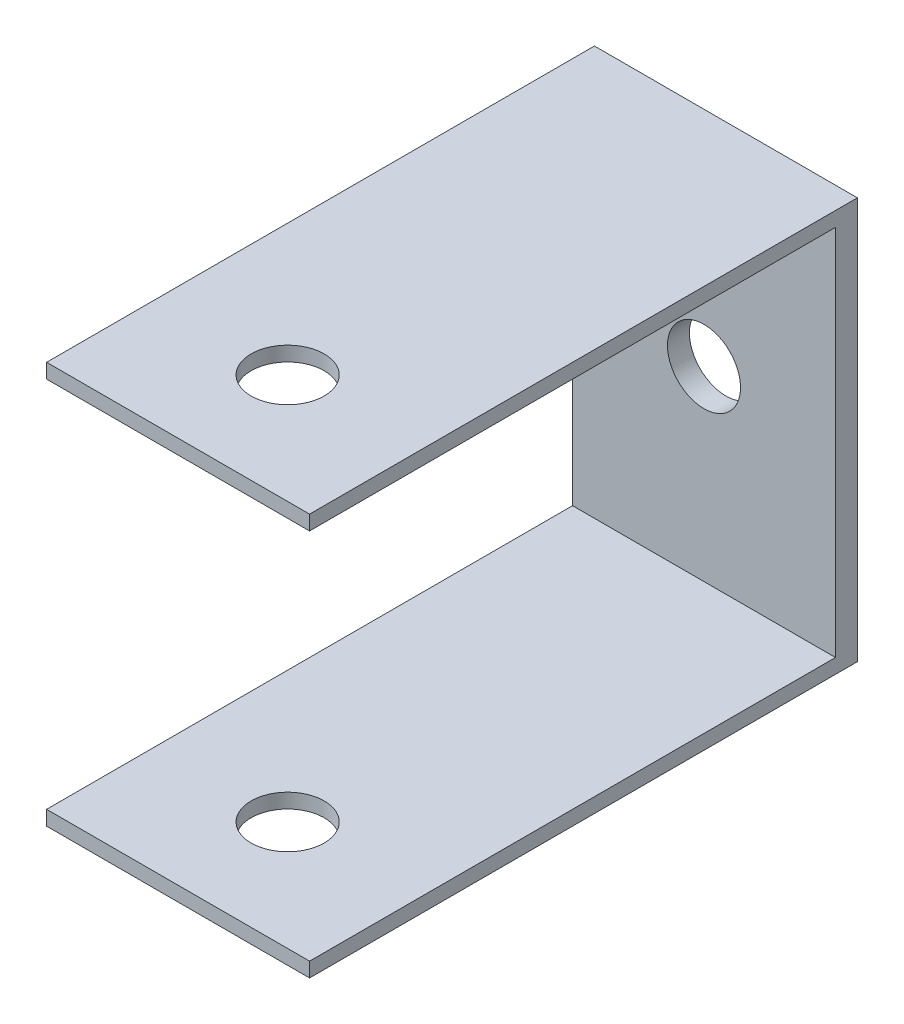
ISO-10303-21;
HEADER;
FILE_DESCRIPTION(('STEP AP214'),'2;1');
FILE_NAME('part.step','',(''),(''),'','','');
FILE_SCHEMA(('AUTOMOTIVE_DESIGN { 1 0 10303 214 1 1 1 1 }'));
ENDSEC;
DATA;
#1=APPLICATION_CONTEXT('core data for automotive mechanical design processes');
#2=APPLICATION_PROTOCOL_DEFINITION('international standard','automotive_design',2000,#1);
#3=PRODUCT_CONTEXT('',#1,'mechanical');
#4=PRODUCT('Part','Part','',(#3));
#5=PRODUCT_RELATED_PRODUCT_CATEGORY('part','',(#4));
#6=PRODUCT_DEFINITION_FORMATION('','',#4);
#7=PRODUCT_DEFINITION_CONTEXT('part definition',#1,'design');
#8=PRODUCT_DEFINITION('design','',#6,#7);
#9=PRODUCT_DEFINITION_SHAPE('','',#8);
#10=(LENGTH_UNIT() NAMED_UNIT(*) SI_UNIT(.MILLI.,.METRE.));
#11=(NAMED_UNIT(*) PLANE_ANGLE_UNIT() SI_UNIT($,.RADIAN.));
#12=(NAMED_UNIT(*) SI_UNIT($,.STERADIAN.) SOLID_ANGLE_UNIT());
#13=UNCERTAINTY_MEASURE_WITH_UNIT(LENGTH_MEASURE(1.E-05),#10,'distance_accuracy_value','');
#14=(GEOMETRIC_REPRESENTATION_CONTEXT(3) GLOBAL_UNCERTAINTY_ASSIGNED_CONTEXT((#13)) GLOBAL_UNIT_ASSIGNED_CONTEXT((#10,
#11,#12)) REPRESENTATION_CONTEXT('',''));
#15=CARTESIAN_POINT('',(0.,0.,0.));
#16=DIRECTION('',(0.,0.,1.));
#17=DIRECTION('',(1.,0.,0.));
#18=AXIS2_PLACEMENT_3D('',#15,#16,#17);
#19=CARTESIAN_POINT('',(0.,0.,57.));
#20=DIRECTION('',(0.,0.,-1.));
#21=DIRECTION('',(-1.,0.,0.));
#22=AXIS2_PLACEMENT_3D('',#19,#20,#21);
#23=CYLINDRICAL_SURFACE('',#22,5.);
#24=CARTESIAN_POINT('',(0.,0.,0.));
#25=DIRECTION('',(0.,0.,-1.));
#26=DIRECTION('',(-1.,0.,0.));
#27=AXIS2_PLACEMENT_3D('',#24,#25,#26);
#28=CIRCLE('',#27,5.);
#29=CARTESIAN_POINT('',(-5.,0.,0.));
#30=VERTEX_POINT('',#29);
#31=EDGE_CURVE('E157',#30,#30,#28,.T.);
#32=CARTESIAN_POINT('',(0.,0.,3.00000000000003));
#33=DIRECTION('',(0.,0.,1.));
#34=DIRECTION('',(1.,0.,0.));
#35=AXIS2_PLACEMENT_3D('',#32,#33,#34);
#36=CIRCLE('',#35,5.);
#37=CARTESIAN_POINT('',(-5.,0.,3.00000000000003));
#38=VERTEX_POINT('',#37);
#39=EDGE_CURVE('E156',#38,#38,#36,.F.);
#40=CARTESIAN_POINT('',(-5.,0.,0.));
#41=CARTESIAN_POINT('',(-5.,0.,0.0312500000000012));
#42=CARTESIAN_POINT('',(-5.,0.,0.0625000000000024));
#43=CARTESIAN_POINT('',(-5.,0.,0.125000000000002));
#44=CARTESIAN_POINT('',(-5.,0.,0.156250000000001));
#45=CARTESIAN_POINT('',(-5.,0.,0.218750000000001));
#46=CARTESIAN_POINT('',(-5.,0.,0.250000000000002));
#47=CARTESIAN_POINT('',(-5.,0.,0.312500000000003));
#48=CARTESIAN_POINT('',(-5.,0.,0.343750000000001));
#49=CARTESIAN_POINT('',(-5.,0.,0.406250000000001));
#50=CARTESIAN_POINT('',(-5.,0.,0.437500000000003));
#51=CARTESIAN_POINT('',(-5.,0.,0.500000000000005));
#52=CARTESIAN_POINT('',(-5.,0.,0.531250000000006));
#53=CARTESIAN_POINT('',(-5.,0.,0.593750000000006));
#54=CARTESIAN_POINT('',(-5.,0.,0.625000000000005));
#55=CARTESIAN_POINT('',(-5.,0.,0.687500000000005));
#56=CARTESIAN_POINT('',(-5.,0.,0.718750000000006));
#57=CARTESIAN_POINT('',(-5.,0.,0.781250000000009));
#58=CARTESIAN_POINT('',(-5.,0.,0.81250000000001));
#59=CARTESIAN_POINT('',(-5.,0.,0.87500000000001));
#60=CARTESIAN_POINT('',(-5.,0.,0.906250000000009));
#61=CARTESIAN_POINT('',(-5.,0.,0.968750000000009));
#62=CARTESIAN_POINT('',(-5.,0.,1.00000000000001));
#63=CARTESIAN_POINT('',(-5.,0.,1.06250000000001));
#64=CARTESIAN_POINT('',(-5.,0.,1.09375000000001));
#65=CARTESIAN_POINT('',(-5.,0.,1.15625000000001));
#66=CARTESIAN_POINT('',(-5.,0.,1.18750000000001));
#67=CARTESIAN_POINT('',(-5.,0.,1.25000000000001));
#68=CARTESIAN_POINT('',(-5.,0.,1.28125000000001));
#69=CARTESIAN_POINT('',(-5.,0.,1.34375000000001));
#70=CARTESIAN_POINT('',(-5.,0.,1.37500000000001));
#71=CARTESIAN_POINT('',(-5.,0.,1.43750000000001));
#72=CARTESIAN_POINT('',(-5.,0.,1.46875000000001));
#73=CARTESIAN_POINT('',(-5.,0.,1.53125000000002));
#74=CARTESIAN_POINT('',(-5.,0.,1.56250000000002));
#75=CARTESIAN_POINT('',(-5.,0.,1.62500000000002));
#76=CARTESIAN_POINT('',(-5.,0.,1.65625000000002));
#77=CARTESIAN_POINT('',(-5.,0.,1.71875000000002));
#78=CARTESIAN_POINT('',(-5.,0.,1.75000000000002));
#79=CARTESIAN_POINT('',(-5.,0.,1.81250000000002));
#80=CARTESIAN_POINT('',(-5.,0.,1.84375000000002));
#81=CARTESIAN_POINT('',(-5.,0.,1.90625000000002));
#82=CARTESIAN_POINT('',(-5.,0.,1.93750000000002));
#83=CARTESIAN_POINT('',(-5.,0.,2.00000000000002));
#84=CARTESIAN_POINT('',(-5.,0.,2.03125000000002));
#85=CARTESIAN_POINT('',(-5.,0.,2.09375000000002));
#86=CARTESIAN_POINT('',(-5.,0.,2.12500000000002));
#87=CARTESIAN_POINT('',(-5.,0.,2.18750000000002));
#88=CARTESIAN_POINT('',(-5.,0.,2.21875000000002));
#89=CARTESIAN_POINT('',(-5.,0.,2.28125000000002));
#90=CARTESIAN_POINT('',(-5.,0.,2.31250000000002));
#91=CARTESIAN_POINT('',(-5.,0.,2.37500000000003));
#92=CARTESIAN_POINT('',(-5.,0.,2.40625000000002));
#93=CARTESIAN_POINT('',(-5.,0.,2.46875000000002));
#94=CARTESIAN_POINT('',(-5.,0.,2.50000000000003));
#95=CARTESIAN_POINT('',(-5.,0.,2.56250000000003));
#96=CARTESIAN_POINT('',(-5.,0.,2.59375000000003));
#97=CARTESIAN_POINT('',(-5.,0.,2.65625000000003));
#98=CARTESIAN_POINT('',(-5.,0.,2.68750000000003));
#99=CARTESIAN_POINT('',(-5.,0.,2.75000000000003));
#100=CARTESIAN_POINT('',(-5.,0.,2.78125000000003));
#101=CARTESIAN_POINT('',(-5.,0.,2.84375000000003));
#102=CARTESIAN_POINT('',(-5.,0.,2.87500000000003));
#103=CARTESIAN_POINT('',(-5.,0.,2.93750000000003));
#104=CARTESIAN_POINT('',(-5.,0.,2.96875000000003));
#105=CARTESIAN_POINT('',(-5.,0.,3.00000000000003));
#106=B_SPLINE_CURVE_WITH_KNOTS('',3,(#40,#41,#42,#43,#44,#45,#46,#47,#48,#49,#50,#51,#52,#53,
#54,#55,#56,#57,#58,#59,#60,#61,#62,#63,#64,#65,#66,#67,#68,#69,#70,#71,#72,#73,#74,#75,#76,#77,
#78,#79,#80,#81,#82,#83,#84,#85,#86,#87,#88,#89,#90,#91,#92,#93,#94,#95,#96,#97,#98,#99,#100,
#101,#102,#103,#104,#105),.UNSPECIFIED.,.F.,.F.,(4,2,2,2,2,2,2,2,2,2,2,2,2,2,2,2,2,2,2,2,2,2,2,
2,2,2,2,2,2,2,2,2,4),(0.,0.0937500000000036,0.1875,0.281250000000004,0.375,0.468750000000004,
0.562500000000007,0.656250000000004,0.750000000000008,0.843750000000011,0.937500000000008,
1.03125000000001,1.12500000000001,1.21875000000001,1.31250000000002,1.40625000000001,
1.50000000000002,1.59375000000002,1.68750000000002,1.78125000000002,1.87500000000002,
1.96875000000002,2.06250000000002,2.15625000000002,2.25000000000002,2.34375000000003,
2.43750000000002,2.53125000000003,2.62500000000003,2.71875000000003,2.81250000000003,
2.90625000000003,3.00000000000003),.UNSPECIFIED.);
#107=EDGE_CURVE('BSEAM39',#30,#38,#106,.T.);
#108=ORIENTED_EDGE('',*,*,#31,.T.);
#109=ORIENTED_EDGE('',*,*,#39,.F.);
#110=ORIENTED_EDGE('',*,*,#107,.T.);
#111=ORIENTED_EDGE('',*,*,#107,.F.);
#112=EDGE_LOOP('',(#108,#110,#109,#111));
#113=FACE_BOUND('',#112,.T.);
#114=ADVANCED_FACE('F39',(#113),#23,.F.);
#115=CARTESIAN_POINT('',(0.,0.,75.));
#116=DIRECTION('',(0.,0.,-1.));
#117=DIRECTION('',(-1.,0.,0.));
#118=AXIS2_PLACEMENT_3D('',#115,#116,#117);
#119=PLANE('',#118);
#120=DIRECTION('',(0.,1.,0.));
#121=VECTOR('',#120,1.);
#122=CARTESIAN_POINT('',(18.,27.5,75.));
#123=LINE('',#122,#121);
#124=CARTESIAN_POINT('',(18.,-27.5,75.));
#125=VERTEX_POINT('',#124);
#126=CARTESIAN_POINT('',(18.,-25.5,75.));
#127=VERTEX_POINT('',#126);
#128=EDGE_CURVE('E180',#125,#127,#123,.T.);
#129=ORIENTED_EDGE('',*,*,#128,.T.);
#130=DIRECTION('',(-1.,0.,0.));
#131=VECTOR('',#130,1.);
#132=CARTESIAN_POINT('',(39.,-25.5,75.));
#133=LINE('',#132,#131);
#134=CARTESIAN_POINT('',(-18.,-25.5,75.));
#135=VERTEX_POINT('',#134);
#136=EDGE_CURVE('E163',#127,#135,#133,.T.);
#137=ORIENTED_EDGE('',*,*,#136,.T.);
#138=DIRECTION('',(0.,-1.,0.));
#139=VECTOR('',#138,1.);
#140=CARTESIAN_POINT('',(-18.,27.5,75.));
#141=LINE('',#140,#139);
#142=CARTESIAN_POINT('',(-18.,-27.5,75.));
#143=VERTEX_POINT('',#142);
#144=EDGE_CURVE('E95',#135,#143,#141,.T.);
#145=ORIENTED_EDGE('',*,*,#144,.T.);
#146=DIRECTION('',(1.,0.,0.));
#147=VECTOR('',#146,1.);
#148=CARTESIAN_POINT('',(18.,-27.5,75.));
#149=LINE('',#148,#147);
#150=EDGE_CURVE('E176',#143,#125,#149,.T.);
#151=ORIENTED_EDGE('',*,*,#150,.T.);
#152=EDGE_LOOP('',(#129,#137,#145,#151));
#153=FACE_BOUND('',#152,.T.);
#154=ADVANCED_FACE('F210',(#153),#119,.F.);
#155=CARTESIAN_POINT('',(-18.,27.5,75.));
#156=DIRECTION('',(1.,0.,0.));
#157=DIRECTION('',(0.,1.,0.));
#158=AXIS2_PLACEMENT_3D('',#155,#156,#157);
#159=PLANE('',#158);
#160=DIRECTION('',(0.,-1.,0.));
#161=VECTOR('',#160,1.);
#162=CARTESIAN_POINT('',(-18.,25.5,3.00000000000003));
#163=LINE('',#162,#161);
#164=CARTESIAN_POINT('',(-18.,25.5,3.00000000000003));
#165=VERTEX_POINT('',#164);
#166=CARTESIAN_POINT('',(-18.,-25.5,3.00000000000003));
#167=VERTEX_POINT('',#166);
#168=EDGE_CURVE('E121',#165,#167,#163,.T.);
#169=ORIENTED_EDGE('',*,*,#168,.F.);
#170=DIRECTION('',(0.,0.,-1.));
#171=VECTOR('',#170,1.);
#172=CARTESIAN_POINT('',(-18.,25.5,19.));
#173=LINE('',#172,#171);
#174=CARTESIAN_POINT('',(-18.,25.5,75.));
#175=VERTEX_POINT('',#174);
#176=EDGE_CURVE('E126',#175,#165,#173,.T.);
#177=ORIENTED_EDGE('',*,*,#176,.F.);
#178=CARTESIAN_POINT('',(-18.,27.5,75.));
#179=VERTEX_POINT('',#178);
#180=EDGE_CURVE('E173',#179,#175,#141,.T.);
#181=ORIENTED_EDGE('',*,*,#180,.F.);
#182=DIRECTION('',(0.,0.,-1.));
#183=VECTOR('',#182,1.);
#184=CARTESIAN_POINT('',(-18.,27.5,75.));
#185=LINE('',#184,#183);
#186=CARTESIAN_POINT('',(-18.,27.5,0.));
#187=VERTEX_POINT('',#186);
#188=EDGE_CURVE('E186',#179,#187,#185,.T.);
#189=ORIENTED_EDGE('',*,*,#188,.T.);
#190=DIRECTION('',(0.,-1.,0.));
#191=VECTOR('',#190,1.);
#192=CARTESIAN_POINT('',(-18.,27.5,0.));
#193=LINE('',#192,#191);
#194=CARTESIAN_POINT('',(-18.,-27.5,0.));
#195=VERTEX_POINT('',#194);
#196=EDGE_CURVE('E172',#187,#195,#193,.T.);
#197=ORIENTED_EDGE('',*,*,#196,.T.);
#198=DIRECTION('',(0.,0.,-1.));
#199=VECTOR('',#198,1.);
#200=CARTESIAN_POINT('',(-18.,-27.5,75.));
#201=LINE('',#200,#199);
#202=EDGE_CURVE('E11',#143,#195,#201,.T.);
#203=ORIENTED_EDGE('',*,*,#202,.F.);
#204=ORIENTED_EDGE('',*,*,#144,.F.);
#205=DIRECTION('',(0.,0.,1.));
#206=VECTOR('',#205,1.);
#207=CARTESIAN_POINT('',(-18.,-25.5,19.));
#208=LINE('',#207,#206);
#209=EDGE_CURVE('E117',#167,#135,#208,.T.);
#210=ORIENTED_EDGE('',*,*,#209,.F.);
#211=EDGE_LOOP('',(#169,#177,#181,#189,#197,#203,#204,#210));
#212=FACE_BOUND('',#211,.T.);
#213=ADVANCED_FACE('F41',(#212),#159,.F.);
#214=CARTESIAN_POINT('',(18.,-27.5,75.));
#215=DIRECTION('',(0.,1.,0.));
#216=DIRECTION('',(-1.,0.,0.));
#217=AXIS2_PLACEMENT_3D('',#214,#215,#216);
#218=PLANE('',#217);
#219=CARTESIAN_POINT('',(0.,-27.5,60.));
#220=DIRECTION('',(0.,-1.,0.));
#221=DIRECTION('',(1.,0.,0.));
#222=AXIS2_PLACEMENT_3D('',#219,#220,#221);
#223=CIRCLE('',#222,5.);
#224=CARTESIAN_POINT('',(5.00000000000001,-27.5,60.));
#225=VERTEX_POINT('',#224);
#226=EDGE_CURVE('E249',#225,#225,#223,.T.);
#227=ORIENTED_EDGE('',*,*,#226,.F.);
#228=EDGE_LOOP('',(#227));
#229=FACE_BOUND('',#228,.T.);
#230=DIRECTION('',(1.,0.,0.));
#231=VECTOR('',#230,1.);
#232=CARTESIAN_POINT('',(18.,-27.5,0.));
#233=LINE('',#232,#231);
#234=CARTESIAN_POINT('',(18.,-27.5,0.));
#235=VERTEX_POINT('',#234);
#236=EDGE_CURVE('E190',#195,#235,#233,.T.);
#237=ORIENTED_EDGE('',*,*,#236,.T.);
#238=DIRECTION('',(0.,0.,-1.));
#239=VECTOR('',#238,1.);
#240=CARTESIAN_POINT('',(18.,-27.5,75.));
#241=LINE('',#240,#239);
#242=EDGE_CURVE('E49',#125,#235,#241,.T.);
#243=ORIENTED_EDGE('',*,*,#242,.F.);
#244=ORIENTED_EDGE('',*,*,#150,.F.);
#245=ORIENTED_EDGE('',*,*,#202,.T.);
#246=EDGE_LOOP('',(#237,#243,#244,#245));
#247=FACE_BOUND('',#246,.T.);
#248=ADVANCED_FACE('F239',(#229,#247),#218,.F.);
#249=CARTESIAN_POINT('',(18.,27.5,75.));
#250=DIRECTION('',(-1.,0.,0.));
#251=DIRECTION('',(0.,-1.,0.));
#252=AXIS2_PLACEMENT_3D('',#249,#250,#251);
#253=PLANE('',#252);
#254=DIRECTION('',(0.,0.,-1.));
#255=VECTOR('',#254,1.);
#256=CARTESIAN_POINT('',(18.,25.5,75.));
#257=LINE('',#256,#255);
#258=CARTESIAN_POINT('',(18.,25.5,75.));
#259=VERTEX_POINT('',#258);
#260=CARTESIAN_POINT('',(18.,25.5,3.00000000000003));
#261=VERTEX_POINT('',#260);
#262=EDGE_CURVE('E57',#259,#261,#257,.T.);
#263=ORIENTED_EDGE('',*,*,#262,.T.);
#264=DIRECTION('',(0.,1.,0.));
#265=VECTOR('',#264,1.);
#266=CARTESIAN_POINT('',(18.,25.5,3.00000000000003));
#267=LINE('',#266,#265);
#268=CARTESIAN_POINT('',(18.,-25.5,3.00000000000003));
#269=VERTEX_POINT('',#268);
#270=EDGE_CURVE('E137',#269,#261,#267,.T.);
#271=ORIENTED_EDGE('',*,*,#270,.F.);
#272=DIRECTION('',(0.,0.,1.));
#273=VECTOR('',#272,1.);
#274=CARTESIAN_POINT('',(18.,-25.5,75.));
#275=LINE('',#274,#273);
#276=EDGE_CURVE('E132',#269,#127,#275,.T.);
#277=ORIENTED_EDGE('',*,*,#276,.T.);
#278=ORIENTED_EDGE('',*,*,#128,.F.);
#279=ORIENTED_EDGE('',*,*,#242,.T.);
#280=DIRECTION('',(0.,1.,0.));
#281=VECTOR('',#280,1.);
#282=CARTESIAN_POINT('',(18.,27.5,0.));
#283=LINE('',#282,#281);
#284=CARTESIAN_POINT('',(18.,27.5,0.));
#285=VERTEX_POINT('',#284);
#286=EDGE_CURVE('E193',#235,#285,#283,.T.);
#287=ORIENTED_EDGE('',*,*,#286,.T.);
#288=DIRECTION('',(0.,0.,-1.));
#289=VECTOR('',#288,1.);
#290=CARTESIAN_POINT('',(18.,27.5,75.));
#291=LINE('',#290,#289);
#292=CARTESIAN_POINT('',(18.,27.5,75.));
#293=VERTEX_POINT('',#292);
#294=EDGE_CURVE('E200',#293,#285,#291,.T.);
#295=ORIENTED_EDGE('',*,*,#294,.F.);
#296=EDGE_CURVE('E179',#259,#293,#123,.T.);
#297=ORIENTED_EDGE('',*,*,#296,.F.);
#298=EDGE_LOOP('',(#263,#271,#277,#278,#279,#287,#295,#297));
#299=FACE_BOUND('',#298,.T.);
#300=ADVANCED_FACE('F236',(#299),#253,.F.);
#301=CARTESIAN_POINT('',(18.,27.5,75.));
#302=DIRECTION('',(0.,-1.,0.));
#303=DIRECTION('',(1.,0.,0.));
#304=AXIS2_PLACEMENT_3D('',#301,#302,#303);
#305=PLANE('',#304);
#306=CARTESIAN_POINT('',(0.,27.5,60.));
#307=DIRECTION('',(0.,-1.,0.));
#308=DIRECTION('',(1.,0.,0.));
#309=AXIS2_PLACEMENT_3D('',#306,#307,#308);
#310=CIRCLE('',#309,5.);
#311=CARTESIAN_POINT('',(4.99999999999999,27.5,60.));
#312=VERTEX_POINT('',#311);
#313=EDGE_CURVE('E144',#312,#312,#310,.T.);
#314=ORIENTED_EDGE('',*,*,#313,.T.);
#315=EDGE_LOOP('',(#314));
#316=FACE_BOUND('',#315,.T.);
#317=DIRECTION('',(-1.,0.,0.));
#318=VECTOR('',#317,1.);
#319=CARTESIAN_POINT('',(18.,27.5,0.));
#320=LINE('',#319,#318);
#321=EDGE_CURVE('E87',#285,#187,#320,.T.);
#322=ORIENTED_EDGE('',*,*,#321,.T.);
#323=ORIENTED_EDGE('',*,*,#188,.F.);
#324=DIRECTION('',(-1.,0.,0.));
#325=VECTOR('',#324,1.);
#326=CARTESIAN_POINT('',(18.,27.5,75.));
#327=LINE('',#326,#325);
#328=EDGE_CURVE('E66',#293,#179,#327,.T.);
#329=ORIENTED_EDGE('',*,*,#328,.F.);
#330=ORIENTED_EDGE('',*,*,#294,.T.);
#331=EDGE_LOOP('',(#322,#323,#329,#330));
#332=FACE_BOUND('',#331,.T.);
#333=ADVANCED_FACE('F230',(#316,#332),#305,.F.);
#334=ORIENTED_EDGE('',*,*,#180,.T.);
#335=DIRECTION('',(-1.,0.,0.));
#336=VECTOR('',#335,1.);
#337=CARTESIAN_POINT('',(39.,25.5,75.));
#338=LINE('',#337,#336);
#339=EDGE_CURVE('E125',#259,#175,#338,.T.);
#340=ORIENTED_EDGE('',*,*,#339,.F.);
#341=ORIENTED_EDGE('',*,*,#296,.T.);
#342=ORIENTED_EDGE('',*,*,#328,.T.);
#343=EDGE_LOOP('',(#334,#340,#341,#342));
#344=FACE_BOUND('',#343,.T.);
#345=ADVANCED_FACE('F217',(#344),#119,.F.);
#346=CARTESIAN_POINT('',(0.,0.,0.));
#347=DIRECTION('',(0.,0.,-1.));
#348=DIRECTION('',(-1.,0.,0.));
#349=AXIS2_PLACEMENT_3D('',#346,#347,#348);
#350=PLANE('',#349);
#351=ORIENTED_EDGE('',*,*,#31,.F.);
#352=EDGE_LOOP('',(#351));
#353=FACE_BOUND('',#352,.T.);
#354=ORIENTED_EDGE('',*,*,#196,.F.);
#355=ORIENTED_EDGE('',*,*,#321,.F.);
#356=ORIENTED_EDGE('',*,*,#286,.F.);
#357=ORIENTED_EDGE('',*,*,#236,.F.);
#358=EDGE_LOOP('',(#354,#355,#356,#357));
#359=FACE_BOUND('',#358,.T.);
#360=ADVANCED_FACE('F224',(#353,#359),#350,.T.);
#361=CARTESIAN_POINT('',(39.,-25.5,19.));
#362=DIRECTION('',(0.,-1.,0.));
#363=DIRECTION('',(1.,0.,0.));
#364=AXIS2_PLACEMENT_3D('',#361,#362,#363);
#365=PLANE('',#364);
#366=CARTESIAN_POINT('',(0.,-25.5,60.));
#367=DIRECTION('',(0.,-1.,0.));
#368=DIRECTION('',(1.,0.,0.));
#369=AXIS2_PLACEMENT_3D('',#366,#367,#368);
#370=CIRCLE('',#369,5.);
#371=CARTESIAN_POINT('',(5.00000000000001,-25.5,60.));
#372=VERTEX_POINT('',#371);
#373=EDGE_CURVE('E148',#372,#372,#370,.T.);
#374=ORIENTED_EDGE('',*,*,#373,.T.);
#375=EDGE_LOOP('',(#374));
#376=FACE_BOUND('',#375,.T.);
#377=ORIENTED_EDGE('',*,*,#276,.F.);
#378=DIRECTION('',(1.,0.,0.));
#379=VECTOR('',#378,1.);
#380=CARTESIAN_POINT('',(-18.,-25.5,3.00000000000003));
#381=LINE('',#380,#379);
#382=EDGE_CURVE('E129',#167,#269,#381,.T.);
#383=ORIENTED_EDGE('',*,*,#382,.F.);
#384=ORIENTED_EDGE('',*,*,#209,.T.);
#385=ORIENTED_EDGE('',*,*,#136,.F.);
#386=EDGE_LOOP('',(#377,#383,#384,#385));
#387=FACE_BOUND('',#386,.T.);
#388=ADVANCED_FACE('F130',(#376,#387),#365,.F.);
#389=CARTESIAN_POINT('',(39.,25.5,19.));
#390=DIRECTION('',(0.,1.,0.));
#391=DIRECTION('',(-1.,0.,0.));
#392=AXIS2_PLACEMENT_3D('',#389,#390,#391);
#393=PLANE('',#392);
#394=CARTESIAN_POINT('',(0.,25.5,60.));
#395=DIRECTION('',(0.,1.,0.));
#396=DIRECTION('',(-1.,0.,0.));
#397=AXIS2_PLACEMENT_3D('',#394,#395,#396);
#398=CIRCLE('',#397,5.);
#399=CARTESIAN_POINT('',(-5.00000000000001,25.5,60.));
#400=VERTEX_POINT('',#399);
#401=EDGE_CURVE('E43',#400,#400,#398,.T.);
#402=ORIENTED_EDGE('',*,*,#401,.T.);
#403=EDGE_LOOP('',(#402));
#404=FACE_BOUND('',#403,.T.);
#405=ORIENTED_EDGE('',*,*,#339,.T.);
#406=ORIENTED_EDGE('',*,*,#176,.T.);
#407=DIRECTION('',(-1.,0.,0.));
#408=VECTOR('',#407,1.);
#409=CARTESIAN_POINT('',(-18.,25.5,3.00000000000003));
#410=LINE('',#409,#408);
#411=EDGE_CURVE('E142',#261,#165,#410,.T.);
#412=ORIENTED_EDGE('',*,*,#411,.F.);
#413=ORIENTED_EDGE('',*,*,#262,.F.);
#414=EDGE_LOOP('',(#405,#406,#412,#413));
#415=FACE_BOUND('',#414,.T.);
#416=ADVANCED_FACE('F223',(#404,#415),#393,.F.);
#417=CARTESIAN_POINT('',(0.,0.,3.00000000000003));
#418=DIRECTION('',(0.,0.,1.));
#419=DIRECTION('',(1.,0.,0.));
#420=AXIS2_PLACEMENT_3D('',#417,#418,#419);
#421=PLANE('',#420);
#422=ORIENTED_EDGE('',*,*,#168,.T.);
#423=ORIENTED_EDGE('',*,*,#382,.T.);
#424=ORIENTED_EDGE('',*,*,#270,.T.);
#425=ORIENTED_EDGE('',*,*,#411,.T.);
#426=EDGE_LOOP('',(#422,#423,#424,#425));
#427=FACE_BOUND('',#426,.T.);
#428=ORIENTED_EDGE('',*,*,#39,.T.);
#429=EDGE_LOOP('',(#428));
#430=FACE_BOUND('',#429,.T.);
#431=ADVANCED_FACE('F140',(#427,#430),#421,.T.);
#432=CARTESIAN_POINT('',(0.,35.5,60.));
#433=DIRECTION('',(0.,-1.,0.));
#434=DIRECTION('',(1.,0.,0.));
#435=AXIS2_PLACEMENT_3D('',#432,#433,#434);
#436=CYLINDRICAL_SURFACE('',#435,5.);
#437=ORIENTED_EDGE('',*,*,#401,.F.);
#438=EDGE_LOOP('',(#437));
#439=FACE_BOUND('',#438,.T.);
#440=ORIENTED_EDGE('',*,*,#313,.F.);
#441=EDGE_LOOP('',(#440));
#442=FACE_BOUND('',#441,.T.);
#443=ADVANCED_FACE('F271',(#439,#442),#436,.F.);
#444=ORIENTED_EDGE('',*,*,#226,.T.);
#445=EDGE_LOOP('',(#444));
#446=FACE_BOUND('',#445,.T.);
#447=ORIENTED_EDGE('',*,*,#373,.F.);
#448=EDGE_LOOP('',(#447));
#449=FACE_BOUND('',#448,.T.);
#450=ADVANCED_FACE('F269',(#446,#449),#436,.F.);
#451=CLOSED_SHELL('',(#114,#154,#213,#248,#300,#333,#345,#360,#388,#416,#431,#443,#450));
#452=MANIFOLD_SOLID_BREP('B2',#451);
#453=ADVANCED_BREP_SHAPE_REPRESENTATION('',(#18,#452),#14);
#454=SHAPE_DEFINITION_REPRESENTATION(#9,#453);
ENDSEC;
END-ISO-10303-21;
